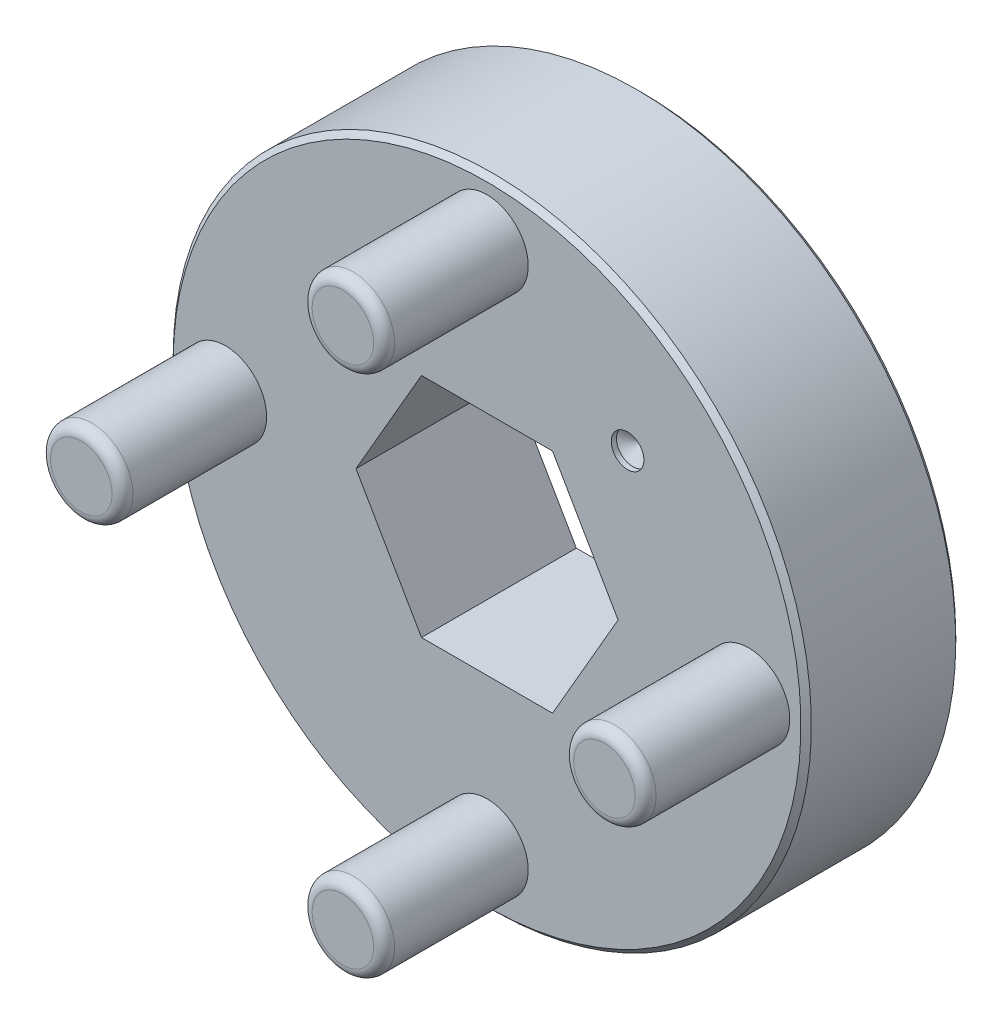
ISO-10303-21;
HEADER;
FILE_DESCRIPTION(('STEP AP214'),'2;1');
FILE_NAME('part.step','',(''),(''),'','','');
FILE_SCHEMA(('AUTOMOTIVE_DESIGN { 1 0 10303 214 1 1 1 1 }'));
ENDSEC;
DATA;
#1=APPLICATION_CONTEXT('core data for automotive mechanical design processes');
#2=APPLICATION_PROTOCOL_DEFINITION('international standard','automotive_design',2000,#1);
#3=PRODUCT_CONTEXT('',#1,'mechanical');
#4=PRODUCT('Part','Part','',(#3));
#5=PRODUCT_RELATED_PRODUCT_CATEGORY('part','',(#4));
#6=PRODUCT_DEFINITION_FORMATION('','',#4);
#7=PRODUCT_DEFINITION_CONTEXT('part definition',#1,'design');
#8=PRODUCT_DEFINITION('design','',#6,#7);
#9=PRODUCT_DEFINITION_SHAPE('','',#8);
#10=(LENGTH_UNIT() NAMED_UNIT(*) SI_UNIT(.MILLI.,.METRE.));
#11=(NAMED_UNIT(*) PLANE_ANGLE_UNIT() SI_UNIT($,.RADIAN.));
#12=(NAMED_UNIT(*) SI_UNIT($,.STERADIAN.) SOLID_ANGLE_UNIT());
#13=UNCERTAINTY_MEASURE_WITH_UNIT(LENGTH_MEASURE(1.E-05),#10,'distance_accuracy_value','');
#14=(GEOMETRIC_REPRESENTATION_CONTEXT(3) GLOBAL_UNCERTAINTY_ASSIGNED_CONTEXT((#13)) GLOBAL_UNIT_ASSIGNED_CONTEXT((#10,
#11,#12)) REPRESENTATION_CONTEXT('',''));
#15=CARTESIAN_POINT('',(0.,0.,0.));
#16=DIRECTION('',(0.,0.,1.));
#17=DIRECTION('',(1.,0.,0.));
#18=AXIS2_PLACEMENT_3D('',#15,#16,#17);
#19=CARTESIAN_POINT('',(-12.7,0.,14.5183999999999));
#20=DIRECTION('',(0.,0.,1.));
#21=DIRECTION('',(1.,0.,0.));
#22=AXIS2_PLACEMENT_3D('',#19,#20,#21);
#23=PLANE('',#22);
#24=CARTESIAN_POINT('',(-12.7,0.,14.5183999999999));
#25=DIRECTION('',(0.,0.,-1.));
#26=DIRECTION('',(1.,0.,0.));
#27=AXIS2_PLACEMENT_3D('',#24,#25,#26);
#28=CIRCLE('',#27,1.49199999999962);
#29=CARTESIAN_POINT('',(-11.2080000000004,0.,14.5183999999999));
#30=VERTEX_POINT('',#29);
#31=CARTESIAN_POINT('',(-14.1919999999996,0.,14.5183999999999));
#32=VERTEX_POINT('',#31);
#33=EDGE_CURVE('E94',#30,#32,#28,.T.);
#34=ORIENTED_EDGE('',*,*,#33,.F.);
#35=CARTESIAN_POINT('',(-12.7,0.,14.5183999999999));
#36=DIRECTION('',(0.,0.,-1.));
#37=DIRECTION('',(-1.,0.,0.));
#38=AXIS2_PLACEMENT_3D('',#35,#36,#37);
#39=CIRCLE('',#38,1.49199999999962);
#40=EDGE_CURVE('E99',#32,#30,#39,.T.);
#41=ORIENTED_EDGE('',*,*,#40,.F.);
#42=EDGE_LOOP('',(#34,#41));
#43=FACE_BOUND('',#42,.T.);
#44=ADVANCED_FACE('F16',(#43),#23,.T.);
#45=CARTESIAN_POINT('',(0.,-12.7,14.5183999999999));
#46=DIRECTION('',(0.,0.,1.));
#47=DIRECTION('',(1.,0.,0.));
#48=AXIS2_PLACEMENT_3D('',#45,#46,#47);
#49=PLANE('',#48);
#50=CARTESIAN_POINT('',(0.,-12.7,14.5183999999999));
#51=DIRECTION('',(0.,0.,-1.));
#52=DIRECTION('',(1.,0.,0.));
#53=AXIS2_PLACEMENT_3D('',#50,#51,#52);
#54=CIRCLE('',#53,1.49200000000013);
#55=CARTESIAN_POINT('',(1.4920000000001,-12.7,14.5183999999999));
#56=VERTEX_POINT('',#55);
#57=CARTESIAN_POINT('',(-1.4920000000001,-12.7,14.5183999999999));
#58=VERTEX_POINT('',#57);
#59=EDGE_CURVE('E352',#56,#58,#54,.T.);
#60=ORIENTED_EDGE('',*,*,#59,.F.);
#61=CARTESIAN_POINT('',(0.,-12.7,14.5183999999999));
#62=DIRECTION('',(0.,0.,-1.));
#63=DIRECTION('',(-1.,0.,0.));
#64=AXIS2_PLACEMENT_3D('',#61,#62,#63);
#65=CIRCLE('',#64,1.49200000000013);
#66=EDGE_CURVE('E102',#58,#56,#65,.T.);
#67=ORIENTED_EDGE('',*,*,#66,.F.);
#68=EDGE_LOOP('',(#60,#67));
#69=FACE_BOUND('',#68,.T.);
#70=ADVANCED_FACE('F356',(#69),#49,.T.);
#71=CARTESIAN_POINT('',(12.7,0.,14.5183999999999));
#72=DIRECTION('',(0.,0.,1.));
#73=DIRECTION('',(1.,0.,0.));
#74=AXIS2_PLACEMENT_3D('',#71,#72,#73);
#75=PLANE('',#74);
#76=CARTESIAN_POINT('',(12.7,0.,14.5183999999999));
#77=DIRECTION('',(0.,0.,-1.));
#78=DIRECTION('',(1.,0.,0.));
#79=AXIS2_PLACEMENT_3D('',#76,#77,#78);
#80=CIRCLE('',#79,1.49199999999962);
#81=CARTESIAN_POINT('',(14.1919999999996,0.,14.5183999999999));
#82=VERTEX_POINT('',#81);
#83=CARTESIAN_POINT('',(11.2080000000004,0.,14.5183999999999));
#84=VERTEX_POINT('',#83);
#85=EDGE_CURVE('E615',#82,#84,#80,.T.);
#86=ORIENTED_EDGE('',*,*,#85,.F.);
#87=CARTESIAN_POINT('',(12.7,0.,14.5183999999999));
#88=DIRECTION('',(0.,0.,-1.));
#89=DIRECTION('',(-1.,0.,0.));
#90=AXIS2_PLACEMENT_3D('',#87,#88,#89);
#91=CIRCLE('',#90,1.49199999999962);
#92=EDGE_CURVE('E333',#84,#82,#91,.T.);
#93=ORIENTED_EDGE('',*,*,#92,.F.);
#94=EDGE_LOOP('',(#86,#93));
#95=FACE_BOUND('',#94,.T.);
#96=ADVANCED_FACE('F177',(#95),#75,.T.);
#97=CARTESIAN_POINT('',(0.,12.7,14.5183999999999));
#98=DIRECTION('',(0.,0.,1.));
#99=DIRECTION('',(1.,0.,0.));
#100=AXIS2_PLACEMENT_3D('',#97,#98,#99);
#101=PLANE('',#100);
#102=CARTESIAN_POINT('',(0.,12.7,14.5183999999999));
#103=DIRECTION('',(0.,0.,-1.));
#104=DIRECTION('',(1.,0.,0.));
#105=AXIS2_PLACEMENT_3D('',#102,#103,#104);
#106=CIRCLE('',#105,1.49200000000013);
#107=CARTESIAN_POINT('',(1.4920000000001,12.7,14.5183999999999));
#108=VERTEX_POINT('',#107);
#109=CARTESIAN_POINT('',(-1.4920000000001,12.7,14.5183999999999));
#110=VERTEX_POINT('',#109);
#111=EDGE_CURVE('E157',#108,#110,#106,.T.);
#112=ORIENTED_EDGE('',*,*,#111,.F.);
#113=CARTESIAN_POINT('',(0.,12.7,14.5183999999999));
#114=DIRECTION('',(0.,0.,-1.));
#115=DIRECTION('',(-1.,0.,0.));
#116=AXIS2_PLACEMENT_3D('',#113,#114,#115);
#117=CIRCLE('',#116,1.49200000000013);
#118=EDGE_CURVE('E321',#110,#108,#117,.T.);
#119=ORIENTED_EDGE('',*,*,#118,.F.);
#120=EDGE_LOOP('',(#112,#119));
#121=FACE_BOUND('',#120,.T.);
#122=ADVANCED_FACE('F167',(#121),#101,.T.);
#123=CARTESIAN_POINT('',(6.82406725314884,7.34483855160416,7.26439999999684));
#124=DIRECTION('',(0.,0.,1.));
#125=DIRECTION('',(0.,-1.,0.));
#126=AXIS2_PLACEMENT_3D('',#123,#124,#125);
#127=CONICAL_SURFACE('',#126,0.793750000070688,1.02974425869632);
#128=CARTESIAN_POINT('',(6.82406725314884,7.34483855160416,7.2644));
#129=DIRECTION('',(0.,0.,1.));
#130=DIRECTION('',(1.,0.,0.));
#131=AXIS2_PLACEMENT_3D('',#128,#129,#130);
#132=CIRCLE('',#131,0.79375);
#133=CARTESIAN_POINT('',(7.61781725314884,7.34483855160416,7.2644));
#134=VERTEX_POINT('',#133);
#135=EDGE_CURVE('E152',#134,#134,#132,.T.);
#136=ORIENTED_EDGE('',*,*,#135,.T.);
#137=EDGE_LOOP('',(#136));
#138=FACE_BOUND('',#137,.T.);
#139=CARTESIAN_POINT('',(6.82406725320561,7.34483855160416,6.78746688365095));
#140=VERTEX_POINT('',#139);
#141=VERTEX_LOOP('',#140);
#142=FACE_BOUND('',#141,.T.);
#143=ADVANCED_FACE('F176',(#138,#142),#127,.F.);
#144=CARTESIAN_POINT('',(-12.7,0.,14.0103999999999));
#145=DIRECTION('',(0.,0.,1.));
#146=DIRECTION('',(1.,0.,0.));
#147=AXIS2_PLACEMENT_3D('',#144,#145,#146);
#148=TOROIDAL_SURFACE('',#147,1.49199999999987,0.508);
#149=ORIENTED_EDGE('',*,*,#40,.T.);
#150=ORIENTED_EDGE('',*,*,#33,.T.);
#151=EDGE_LOOP('',(#149,#150));
#152=FACE_BOUND('',#151,.T.);
#153=CARTESIAN_POINT('',(-12.7,0.,14.0103999999999));
#154=DIRECTION('',(0.,0.,-1.));
#155=DIRECTION('',(-1.,0.,0.));
#156=AXIS2_PLACEMENT_3D('',#153,#154,#155);
#157=CIRCLE('',#156,1.99999999999987);
#158=CARTESIAN_POINT('',(-14.6999999999999,0.,14.0103999999999));
#159=VERTEX_POINT('',#158);
#160=EDGE_CURVE('E150',#159,#159,#157,.T.);
#161=ORIENTED_EDGE('',*,*,#160,.F.);
#162=EDGE_LOOP('',(#161));
#163=FACE_BOUND('',#162,.T.);
#164=ADVANCED_FACE('F97',(#152,#163),#148,.T.);
#165=CARTESIAN_POINT('',(0.,-12.7,14.0103999999999));
#166=DIRECTION('',(0.,0.,1.));
#167=DIRECTION('',(1.,0.,0.));
#168=AXIS2_PLACEMENT_3D('',#165,#166,#167);
#169=TOROIDAL_SURFACE('',#168,1.49199999999987,0.508);
#170=ORIENTED_EDGE('',*,*,#66,.T.);
#171=ORIENTED_EDGE('',*,*,#59,.T.);
#172=EDGE_LOOP('',(#170,#171));
#173=FACE_BOUND('',#172,.T.);
#174=CARTESIAN_POINT('',(0.,-12.7,14.0103999999999));
#175=DIRECTION('',(0.,0.,-1.));
#176=DIRECTION('',(-1.,0.,0.));
#177=AXIS2_PLACEMENT_3D('',#174,#175,#176);
#178=CIRCLE('',#177,1.99999999999987);
#179=CARTESIAN_POINT('',(-1.99999999999987,-12.7,14.0103999999999));
#180=VERTEX_POINT('',#179);
#181=EDGE_CURVE('E149',#180,#180,#178,.T.);
#182=ORIENTED_EDGE('',*,*,#181,.F.);
#183=EDGE_LOOP('',(#182));
#184=FACE_BOUND('',#183,.T.);
#185=ADVANCED_FACE('F127',(#173,#184),#169,.T.);
#186=CARTESIAN_POINT('',(12.7,0.,14.0103999999999));
#187=DIRECTION('',(0.,0.,1.));
#188=DIRECTION('',(1.,0.,0.));
#189=AXIS2_PLACEMENT_3D('',#186,#187,#188);
#190=TOROIDAL_SURFACE('',#189,1.49199999999987,0.508);
#191=ORIENTED_EDGE('',*,*,#92,.T.);
#192=ORIENTED_EDGE('',*,*,#85,.T.);
#193=EDGE_LOOP('',(#191,#192));
#194=FACE_BOUND('',#193,.T.);
#195=CARTESIAN_POINT('',(12.7,0.,14.0103999999999));
#196=DIRECTION('',(0.,0.,-1.));
#197=DIRECTION('',(-1.,0.,0.));
#198=AXIS2_PLACEMENT_3D('',#195,#196,#197);
#199=CIRCLE('',#198,1.99999999999987);
#200=CARTESIAN_POINT('',(10.7000000000001,0.,14.0103999999999));
#201=VERTEX_POINT('',#200);
#202=EDGE_CURVE('E213',#201,#201,#199,.T.);
#203=ORIENTED_EDGE('',*,*,#202,.F.);
#204=EDGE_LOOP('',(#203));
#205=FACE_BOUND('',#204,.T.);
#206=ADVANCED_FACE('F137',(#194,#205),#190,.T.);
#207=CARTESIAN_POINT('',(0.,12.7,14.0103999999999));
#208=DIRECTION('',(0.,0.,1.));
#209=DIRECTION('',(1.,0.,0.));
#210=AXIS2_PLACEMENT_3D('',#207,#208,#209);
#211=TOROIDAL_SURFACE('',#210,1.49199999999987,0.508);
#212=ORIENTED_EDGE('',*,*,#118,.T.);
#213=ORIENTED_EDGE('',*,*,#111,.T.);
#214=EDGE_LOOP('',(#212,#213));
#215=FACE_BOUND('',#214,.T.);
#216=CARTESIAN_POINT('',(0.,12.7,14.0103999999999));
#217=DIRECTION('',(0.,0.,-1.));
#218=DIRECTION('',(-1.,0.,0.));
#219=AXIS2_PLACEMENT_3D('',#216,#217,#218);
#220=CIRCLE('',#219,1.99999999999987);
#221=CARTESIAN_POINT('',(-1.99999999999987,12.7,14.0103999999999));
#222=VERTEX_POINT('',#221);
#223=EDGE_CURVE('E211',#222,#222,#220,.T.);
#224=ORIENTED_EDGE('',*,*,#223,.F.);
#225=EDGE_LOOP('',(#224));
#226=FACE_BOUND('',#225,.T.);
#227=ADVANCED_FACE('F195',(#215,#226),#211,.T.);
#228=CARTESIAN_POINT('',(0.,0.,7.26439999999998));
#229=DIRECTION('',(0.,0.,-1.));
#230=DIRECTION('',(-1.,0.,0.));
#231=AXIS2_PLACEMENT_3D('',#228,#229,#230);
#232=CONICAL_SURFACE('',#231,15.494,0.7853981633973);
#233=CARTESIAN_POINT('',(0.,0.,7.2644));
#234=DIRECTION('',(0.,0.,-1.));
#235=DIRECTION('',(-1.,0.,0.));
#236=AXIS2_PLACEMENT_3D('',#233,#234,#235);
#237=CIRCLE('',#236,15.494);
#238=CARTESIAN_POINT('',(-15.494,0.,7.2644));
#239=VERTEX_POINT('',#238);
#240=EDGE_CURVE('E219',#239,#239,#237,.T.);
#241=ORIENTED_EDGE('',*,*,#240,.F.);
#242=EDGE_LOOP('',(#241));
#243=FACE_BOUND('',#242,.T.);
#244=CARTESIAN_POINT('',(0.,0.,7.51840000000002));
#245=DIRECTION('',(0.,0.,-1.));
#246=DIRECTION('',(-1.,0.,0.));
#247=AXIS2_PLACEMENT_3D('',#244,#245,#246);
#248=CIRCLE('',#247,15.24);
#249=CARTESIAN_POINT('',(-15.24,0.,7.51840000000002));
#250=VERTEX_POINT('',#249);
#251=EDGE_CURVE('E317',#250,#250,#248,.F.);
#252=ORIENTED_EDGE('',*,*,#251,.F.);
#253=EDGE_LOOP('',(#252));
#254=FACE_BOUND('',#253,.T.);
#255=ADVANCED_FACE('F205',(#243,#254),#232,.T.);
#256=CARTESIAN_POINT('',(6.82406725314884,7.34483855160416,7.5184));
#257=DIRECTION('',(0.,0.,1.));
#258=DIRECTION('',(1.,0.,0.));
#259=AXIS2_PLACEMENT_3D('',#256,#257,#258);
#260=CYLINDRICAL_SURFACE('',#259,0.79375);
#261=CARTESIAN_POINT('',(6.82406725314884,7.34483855160416,7.5184));
#262=DIRECTION('',(0.,0.,1.));
#263=DIRECTION('',(1.,0.,0.));
#264=AXIS2_PLACEMENT_3D('',#261,#262,#263);
#265=CIRCLE('',#264,0.79375);
#266=CARTESIAN_POINT('',(7.61781725314884,7.34483855160416,7.5184));
#267=VERTEX_POINT('',#266);
#268=EDGE_CURVE('E314',#267,#267,#265,.F.);
#269=ORIENTED_EDGE('',*,*,#268,.F.);
#270=EDGE_LOOP('',(#269));
#271=FACE_BOUND('',#270,.T.);
#272=ORIENTED_EDGE('',*,*,#135,.F.);
#273=EDGE_LOOP('',(#272));
#274=FACE_BOUND('',#273,.T.);
#275=ADVANCED_FACE('F238',(#271,#274),#260,.F.);
#276=CARTESIAN_POINT('',(-12.7,0.,14.5183999999999));
#277=DIRECTION('',(0.,0.,-1.));
#278=DIRECTION('',(-1.,0.,0.));
#279=AXIS2_PLACEMENT_3D('',#276,#277,#278);
#280=CYLINDRICAL_SURFACE('',#279,1.99999999999987);
#281=CARTESIAN_POINT('',(-12.7,0.,7.5184));
#282=DIRECTION('',(0.,0.,-1.));
#283=DIRECTION('',(-1.,0.,0.));
#284=AXIS2_PLACEMENT_3D('',#281,#282,#283);
#285=CIRCLE('',#284,1.99999999999987);
#286=CARTESIAN_POINT('',(-14.6999999999999,0.,7.5184));
#287=VERTEX_POINT('',#286);
#288=EDGE_CURVE('E311',#287,#287,#285,.T.);
#289=ORIENTED_EDGE('',*,*,#288,.F.);
#290=EDGE_LOOP('',(#289));
#291=FACE_BOUND('',#290,.T.);
#292=ORIENTED_EDGE('',*,*,#160,.T.);
#293=EDGE_LOOP('',(#292));
#294=FACE_BOUND('',#293,.T.);
#295=ADVANCED_FACE('F227',(#291,#294),#280,.T.);
#296=CARTESIAN_POINT('',(0.,-12.7,14.5183999999999));
#297=DIRECTION('',(0.,0.,-1.));
#298=DIRECTION('',(-1.,0.,0.));
#299=AXIS2_PLACEMENT_3D('',#296,#297,#298);
#300=CYLINDRICAL_SURFACE('',#299,1.99999999999987);
#301=CARTESIAN_POINT('',(0.,-12.7,7.5184));
#302=DIRECTION('',(0.,0.,-1.));
#303=DIRECTION('',(-1.,0.,0.));
#304=AXIS2_PLACEMENT_3D('',#301,#302,#303);
#305=CIRCLE('',#304,1.99999999999987);
#306=CARTESIAN_POINT('',(-1.99999999999987,-12.7,7.5184));
#307=VERTEX_POINT('',#306);
#308=EDGE_CURVE('E304',#307,#307,#305,.T.);
#309=ORIENTED_EDGE('',*,*,#308,.F.);
#310=EDGE_LOOP('',(#309));
#311=FACE_BOUND('',#310,.T.);
#312=ORIENTED_EDGE('',*,*,#181,.T.);
#313=EDGE_LOOP('',(#312));
#314=FACE_BOUND('',#313,.T.);
#315=ADVANCED_FACE('F223',(#311,#314),#300,.T.);
#316=CARTESIAN_POINT('',(12.7,0.,14.5183999999999));
#317=DIRECTION('',(0.,0.,-1.));
#318=DIRECTION('',(-1.,0.,0.));
#319=AXIS2_PLACEMENT_3D('',#316,#317,#318);
#320=CYLINDRICAL_SURFACE('',#319,1.99999999999987);
#321=CARTESIAN_POINT('',(12.7,0.,7.5184));
#322=DIRECTION('',(0.,0.,-1.));
#323=DIRECTION('',(-1.,0.,0.));
#324=AXIS2_PLACEMENT_3D('',#321,#322,#323);
#325=CIRCLE('',#324,1.99999999999987);
#326=CARTESIAN_POINT('',(10.7000000000001,0.,7.5184));
#327=VERTEX_POINT('',#326);
#328=EDGE_CURVE('E298',#327,#327,#325,.T.);
#329=ORIENTED_EDGE('',*,*,#328,.F.);
#330=EDGE_LOOP('',(#329));
#331=FACE_BOUND('',#330,.T.);
#332=ORIENTED_EDGE('',*,*,#202,.T.);
#333=EDGE_LOOP('',(#332));
#334=FACE_BOUND('',#333,.T.);
#335=ADVANCED_FACE('F226',(#331,#334),#320,.T.);
#336=CARTESIAN_POINT('',(0.,12.7,14.5183999999999));
#337=DIRECTION('',(0.,0.,-1.));
#338=DIRECTION('',(-1.,0.,0.));
#339=AXIS2_PLACEMENT_3D('',#336,#337,#338);
#340=CYLINDRICAL_SURFACE('',#339,1.99999999999987);
#341=CARTESIAN_POINT('',(0.,12.7,7.5184));
#342=DIRECTION('',(0.,0.,-1.));
#343=DIRECTION('',(-1.,0.,0.));
#344=AXIS2_PLACEMENT_3D('',#341,#342,#343);
#345=CIRCLE('',#344,1.99999999999987);
#346=CARTESIAN_POINT('',(-1.99999999999987,12.7,7.5184));
#347=VERTEX_POINT('',#346);
#348=EDGE_CURVE('E293',#347,#347,#345,.T.);
#349=ORIENTED_EDGE('',*,*,#348,.F.);
#350=EDGE_LOOP('',(#349));
#351=FACE_BOUND('',#350,.T.);
#352=ORIENTED_EDGE('',*,*,#223,.T.);
#353=EDGE_LOOP('',(#352));
#354=FACE_BOUND('',#353,.T.);
#355=ADVANCED_FACE('F235',(#351,#354),#340,.T.);
#356=CARTESIAN_POINT('',(0.,0.,7.5184));
#357=DIRECTION('',(0.,0.,-1.));
#358=DIRECTION('',(-1.,0.,0.));
#359=AXIS2_PLACEMENT_3D('',#356,#357,#358);
#360=CYLINDRICAL_SURFACE('',#359,15.494);
#361=CARTESIAN_POINT('',(0.,0.,0.253999999999994));
#362=DIRECTION('',(0.,0.,1.));
#363=DIRECTION('',(1.,0.,0.));
#364=AXIS2_PLACEMENT_3D('',#361,#362,#363);
#365=CIRCLE('',#364,15.494);
#366=CARTESIAN_POINT('',(15.494,0.,0.253999999999993));
#367=VERTEX_POINT('',#366);
#368=EDGE_CURVE('E297',#367,#367,#365,.F.);
#369=ORIENTED_EDGE('',*,*,#368,.F.);
#370=EDGE_LOOP('',(#369));
#371=FACE_BOUND('',#370,.T.);
#372=ORIENTED_EDGE('',*,*,#240,.T.);
#373=EDGE_LOOP('',(#372));
#374=FACE_BOUND('',#373,.T.);
#375=ADVANCED_FACE('F281',(#371,#374),#360,.T.);
#376=CARTESIAN_POINT('',(0.,0.,7.5184));
#377=DIRECTION('',(0.,0.,1.));
#378=DIRECTION('',(1.,0.,0.));
#379=AXIS2_PLACEMENT_3D('',#376,#377,#378);
#380=PLANE('',#379);
#381=DIRECTION('',(-0.500000000000017,0.866025403784429,0.));
#382=VECTOR('',#381,1.);
#383=CARTESIAN_POINT('',(6.3627,0.,7.5184));
#384=LINE('',#383,#382);
#385=CARTESIAN_POINT('',(3.18134999999998,5.51025983665919,7.5184));
#386=VERTEX_POINT('',#385);
#387=CARTESIAN_POINT('',(6.36270000000002,0.,7.5184));
#388=VERTEX_POINT('',#387);
#389=EDGE_CURVE('E574',#386,#388,#384,.F.);
#390=ORIENTED_EDGE('',*,*,#389,.T.);
#391=DIRECTION('',(0.500000000000017,0.866025403784429,0.));
#392=VECTOR('',#391,1.);
#393=CARTESIAN_POINT('',(3.18135,-5.5102598366592,7.5184));
#394=LINE('',#393,#392);
#395=CARTESIAN_POINT('',(3.18135,-5.5102598366592,7.5184));
#396=VERTEX_POINT('',#395);
#397=EDGE_CURVE('E580',#388,#396,#394,.F.);
#398=ORIENTED_EDGE('',*,*,#397,.T.);
#399=DIRECTION('',(1.,0.,0.));
#400=VECTOR('',#399,1.);
#401=CARTESIAN_POINT('',(-3.18135,-5.5102598366592,7.5184));
#402=LINE('',#401,#400);
#403=CARTESIAN_POINT('',(-3.18134999999998,-5.51025983665919,7.5184));
#404=VERTEX_POINT('',#403);
#405=EDGE_CURVE('E301',#396,#404,#402,.F.);
#406=ORIENTED_EDGE('',*,*,#405,.T.);
#407=DIRECTION('',(0.500000000000017,-0.866025403784429,0.));
#408=VECTOR('',#407,1.);
#409=CARTESIAN_POINT('',(-6.3627,0.,7.5184));
#410=LINE('',#409,#408);
#411=CARTESIAN_POINT('',(-6.36270000000002,0.,7.5184));
#412=VERTEX_POINT('',#411);
#413=EDGE_CURVE('E556',#404,#412,#410,.F.);
#414=ORIENTED_EDGE('',*,*,#413,.T.);
#415=DIRECTION('',(-0.500000000000017,-0.866025403784429,0.));
#416=VECTOR('',#415,1.);
#417=CARTESIAN_POINT('',(-3.18135,5.5102598366592,7.5184));
#418=LINE('',#417,#416);
#419=CARTESIAN_POINT('',(-3.18135,5.5102598366592,7.5184));
#420=VERTEX_POINT('',#419);
#421=EDGE_CURVE('E562',#412,#420,#418,.F.);
#422=ORIENTED_EDGE('',*,*,#421,.T.);
#423=DIRECTION('',(1.,0.,0.));
#424=VECTOR('',#423,1.);
#425=CARTESIAN_POINT('',(3.18135,5.5102598366592,7.5184));
#426=LINE('',#425,#424);
#427=EDGE_CURVE('E568',#420,#386,#426,.T.);
#428=ORIENTED_EDGE('',*,*,#427,.T.);
#429=EDGE_LOOP('',(#390,#398,#406,#414,#422,#428));
#430=FACE_BOUND('',#429,.T.);
#431=ORIENTED_EDGE('',*,*,#348,.T.);
#432=EDGE_LOOP('',(#431));
#433=FACE_BOUND('',#432,.T.);
#434=ORIENTED_EDGE('',*,*,#328,.T.);
#435=EDGE_LOOP('',(#434));
#436=FACE_BOUND('',#435,.T.);
#437=ORIENTED_EDGE('',*,*,#308,.T.);
#438=EDGE_LOOP('',(#437));
#439=FACE_BOUND('',#438,.T.);
#440=ORIENTED_EDGE('',*,*,#288,.T.);
#441=EDGE_LOOP('',(#440));
#442=FACE_BOUND('',#441,.T.);
#443=ORIENTED_EDGE('',*,*,#268,.T.);
#444=EDGE_LOOP('',(#443));
#445=FACE_BOUND('',#444,.T.);
#446=ORIENTED_EDGE('',*,*,#251,.T.);
#447=EDGE_LOOP('',(#446));
#448=FACE_BOUND('',#447,.T.);
#449=ADVANCED_FACE('F277',(#430,#433,#436,#439,#442,#445,#448),#380,.T.);
#450=CARTESIAN_POINT('',(0.,0.,0.253999999999993));
#451=DIRECTION('',(0.,0.,1.));
#452=DIRECTION('',(1.,0.,0.));
#453=AXIS2_PLACEMENT_3D('',#450,#451,#452);
#454=CONICAL_SURFACE('',#453,15.494,0.7853981633973);
#455=ORIENTED_EDGE('',*,*,#368,.T.);
#456=EDGE_LOOP('',(#455));
#457=FACE_BOUND('',#456,.T.);
#458=CARTESIAN_POINT('',(0.,0.,0.));
#459=DIRECTION('',(0.,0.,1.));
#460=DIRECTION('',(1.,0.,0.));
#461=AXIS2_PLACEMENT_3D('',#458,#459,#460);
#462=CIRCLE('',#461,15.24);
#463=CARTESIAN_POINT('',(15.24,0.,0.));
#464=VERTEX_POINT('',#463);
#465=EDGE_CURVE('E307',#464,#464,#462,.T.);
#466=ORIENTED_EDGE('',*,*,#465,.T.);
#467=EDGE_LOOP('',(#466));
#468=FACE_BOUND('',#467,.T.);
#469=ADVANCED_FACE('F273',(#457,#468),#454,.T.);
#470=CARTESIAN_POINT('',(-3.18135,-5.5102598366592,0.));
#471=DIRECTION('',(0.,-1.,0.));
#472=DIRECTION('',(0.,0.,-1.));
#473=AXIS2_PLACEMENT_3D('',#470,#471,#472);
#474=PLANE('',#473);
#475=DIRECTION('',(1.,0.,0.));
#476=VECTOR('',#475,1.);
#477=CARTESIAN_POINT('',(0.,-5.5102598366592,0.));
#478=LINE('',#477,#476);
#479=CARTESIAN_POINT('',(3.18135,-5.5102598366592,0.));
#480=VERTEX_POINT('',#479);
#481=CARTESIAN_POINT('',(-3.18134999999998,-5.51025983665919,0.));
#482=VERTEX_POINT('',#481);
#483=EDGE_CURVE('E587',#480,#482,#478,.F.);
#484=ORIENTED_EDGE('',*,*,#483,.T.);
#485=DIRECTION('',(0.,0.,1.));
#486=VECTOR('',#485,1.);
#487=CARTESIAN_POINT('',(-3.18134999999991,-5.51025983665915,0.));
#488=LINE('',#487,#486);
#489=EDGE_CURVE('E559',#482,#404,#488,.T.);
#490=ORIENTED_EDGE('',*,*,#489,.T.);
#491=ORIENTED_EDGE('',*,*,#405,.F.);
#492=DIRECTION('',(0.,0.,1.));
#493=VECTOR('',#492,1.);
#494=CARTESIAN_POINT('',(3.18135,-5.5102598366592,0.));
#495=LINE('',#494,#493);
#496=EDGE_CURVE('E583',#396,#480,#495,.F.);
#497=ORIENTED_EDGE('',*,*,#496,.T.);
#498=EDGE_LOOP('',(#484,#490,#491,#497));
#499=FACE_BOUND('',#498,.T.);
#500=ADVANCED_FACE('F269',(#499),#474,.F.);
#501=CARTESIAN_POINT('',(-6.3627,0.,0.));
#502=DIRECTION('',(-0.866025403784429,-0.500000000000017,0.));
#503=DIRECTION('',(0.500000000000017,-0.866025403784429,0.));
#504=AXIS2_PLACEMENT_3D('',#501,#502,#503);
#505=PLANE('',#504);
#506=DIRECTION('',(-0.500000000000003,0.866025403784437,0.));
#507=VECTOR('',#506,1.);
#508=CARTESIAN_POINT('',(-3.18135,-5.5102598366592,0.));
#509=LINE('',#508,#507);
#510=CARTESIAN_POINT('',(-6.36270000000002,0.,0.));
#511=VERTEX_POINT('',#510);
#512=EDGE_CURVE('E590',#482,#511,#509,.T.);
#513=ORIENTED_EDGE('',*,*,#512,.T.);
#514=DIRECTION('',(0.,0.,1.));
#515=VECTOR('',#514,1.);
#516=CARTESIAN_POINT('',(-6.36270000000009,0.,0.));
#517=LINE('',#516,#515);
#518=EDGE_CURVE('E565',#511,#412,#517,.T.);
#519=ORIENTED_EDGE('',*,*,#518,.T.);
#520=ORIENTED_EDGE('',*,*,#413,.F.);
#521=ORIENTED_EDGE('',*,*,#489,.F.);
#522=EDGE_LOOP('',(#513,#519,#520,#521));
#523=FACE_BOUND('',#522,.T.);
#524=ADVANCED_FACE('F265',(#523),#505,.F.);
#525=CARTESIAN_POINT('',(-3.18135,5.5102598366592,0.));
#526=DIRECTION('',(-0.866025403784429,0.500000000000017,0.));
#527=DIRECTION('',(-0.500000000000017,-0.866025403784429,0.));
#528=AXIS2_PLACEMENT_3D('',#525,#526,#527);
#529=PLANE('',#528);
#530=DIRECTION('',(0.500000000000003,0.866025403784437,0.));
#531=VECTOR('',#530,1.);
#532=CARTESIAN_POINT('',(-6.3627,0.,0.));
#533=LINE('',#532,#531);
#534=CARTESIAN_POINT('',(-3.18135,5.5102598366592,0.));
#535=VERTEX_POINT('',#534);
#536=EDGE_CURVE('E593',#511,#535,#533,.T.);
#537=ORIENTED_EDGE('',*,*,#536,.T.);
#538=DIRECTION('',(0.,0.,1.));
#539=VECTOR('',#538,1.);
#540=CARTESIAN_POINT('',(-3.18135,5.5102598366592,0.));
#541=LINE('',#540,#539);
#542=EDGE_CURVE('E571',#535,#420,#541,.T.);
#543=ORIENTED_EDGE('',*,*,#542,.T.);
#544=ORIENTED_EDGE('',*,*,#421,.F.);
#545=ORIENTED_EDGE('',*,*,#518,.F.);
#546=EDGE_LOOP('',(#537,#543,#544,#545));
#547=FACE_BOUND('',#546,.T.);
#548=ADVANCED_FACE('F261',(#547),#529,.F.);
#549=CARTESIAN_POINT('',(3.18135,5.5102598366592,0.));
#550=DIRECTION('',(0.,1.,0.));
#551=DIRECTION('',(0.,0.,1.));
#552=AXIS2_PLACEMENT_3D('',#549,#550,#551);
#553=PLANE('',#552);
#554=DIRECTION('',(1.,0.,0.));
#555=VECTOR('',#554,1.);
#556=CARTESIAN_POINT('',(0.,5.5102598366592,0.));
#557=LINE('',#556,#555);
#558=CARTESIAN_POINT('',(3.18134999999998,5.51025983665919,0.));
#559=VERTEX_POINT('',#558);
#560=EDGE_CURVE('E596',#535,#559,#557,.T.);
#561=ORIENTED_EDGE('',*,*,#560,.T.);
#562=DIRECTION('',(0.,0.,1.));
#563=VECTOR('',#562,1.);
#564=CARTESIAN_POINT('',(3.18134999999991,5.51025983665915,0.));
#565=LINE('',#564,#563);
#566=EDGE_CURVE('E577',#559,#386,#565,.T.);
#567=ORIENTED_EDGE('',*,*,#566,.T.);
#568=ORIENTED_EDGE('',*,*,#427,.F.);
#569=ORIENTED_EDGE('',*,*,#542,.F.);
#570=EDGE_LOOP('',(#561,#567,#568,#569));
#571=FACE_BOUND('',#570,.T.);
#572=ADVANCED_FACE('F257',(#571),#553,.F.);
#573=CARTESIAN_POINT('',(6.3627,0.,0.));
#574=DIRECTION('',(0.866025403784429,0.500000000000017,0.));
#575=DIRECTION('',(-0.500000000000017,0.866025403784429,0.));
#576=AXIS2_PLACEMENT_3D('',#573,#574,#575);
#577=PLANE('',#576);
#578=DIRECTION('',(0.500000000000003,-0.866025403784437,0.));
#579=VECTOR('',#578,1.);
#580=CARTESIAN_POINT('',(3.18135,5.5102598366592,0.));
#581=LINE('',#580,#579);
#582=CARTESIAN_POINT('',(6.36270000000002,0.,0.));
#583=VERTEX_POINT('',#582);
#584=EDGE_CURVE('E28',#559,#583,#581,.T.);
#585=ORIENTED_EDGE('',*,*,#584,.T.);
#586=DIRECTION('',(0.,0.,1.));
#587=VECTOR('',#586,1.);
#588=CARTESIAN_POINT('',(6.36270000000009,0.,0.));
#589=LINE('',#588,#587);
#590=EDGE_CURVE('E36',#583,#388,#589,.T.);
#591=ORIENTED_EDGE('',*,*,#590,.T.);
#592=ORIENTED_EDGE('',*,*,#389,.F.);
#593=ORIENTED_EDGE('',*,*,#566,.F.);
#594=EDGE_LOOP('',(#585,#591,#592,#593));
#595=FACE_BOUND('',#594,.T.);
#596=ADVANCED_FACE('F250',(#595),#577,.F.);
#597=CARTESIAN_POINT('',(3.18135,-5.5102598366592,0.));
#598=DIRECTION('',(0.866025403784429,-0.500000000000017,0.));
#599=DIRECTION('',(0.500000000000017,0.866025403784429,0.));
#600=AXIS2_PLACEMENT_3D('',#597,#598,#599);
#601=PLANE('',#600);
#602=DIRECTION('',(-0.500000000000003,-0.866025403784437,0.));
#603=VECTOR('',#602,1.);
#604=CARTESIAN_POINT('',(6.3627,0.,0.));
#605=LINE('',#604,#603);
#606=EDGE_CURVE('E11',#583,#480,#605,.T.);
#607=ORIENTED_EDGE('',*,*,#606,.T.);
#608=ORIENTED_EDGE('',*,*,#496,.F.);
#609=ORIENTED_EDGE('',*,*,#397,.F.);
#610=ORIENTED_EDGE('',*,*,#590,.F.);
#611=EDGE_LOOP('',(#607,#608,#609,#610));
#612=FACE_BOUND('',#611,.T.);
#613=ADVANCED_FACE('F244',(#612),#601,.F.);
#614=CARTESIAN_POINT('',(0.,0.,0.));
#615=DIRECTION('',(0.,0.,1.));
#616=DIRECTION('',(1.,0.,0.));
#617=AXIS2_PLACEMENT_3D('',#614,#615,#616);
#618=PLANE('',#617);
#619=ORIENTED_EDGE('',*,*,#584,.F.);
#620=ORIENTED_EDGE('',*,*,#560,.F.);
#621=ORIENTED_EDGE('',*,*,#536,.F.);
#622=ORIENTED_EDGE('',*,*,#512,.F.);
#623=ORIENTED_EDGE('',*,*,#483,.F.);
#624=ORIENTED_EDGE('',*,*,#606,.F.);
#625=EDGE_LOOP('',(#619,#620,#621,#622,#623,#624));
#626=FACE_BOUND('',#625,.T.);
#627=ORIENTED_EDGE('',*,*,#465,.F.);
#628=EDGE_LOOP('',(#627));
#629=FACE_BOUND('',#628,.T.);
#630=ADVANCED_FACE('F242',(#626,#629),#618,.F.);
#631=CLOSED_SHELL('',(#44,#70,#96,#122,#143,#164,#185,#206,#227,#255,#275,#295,#315,#335,#355,
#375,#449,#469,#500,#524,#548,#572,#596,#613,#630));
#632=MANIFOLD_SOLID_BREP('B1',#631);
#633=ADVANCED_BREP_SHAPE_REPRESENTATION('',(#18,#632),#14);
#634=SHAPE_DEFINITION_REPRESENTATION(#9,#633);
ENDSEC;
END-ISO-10303-21;
